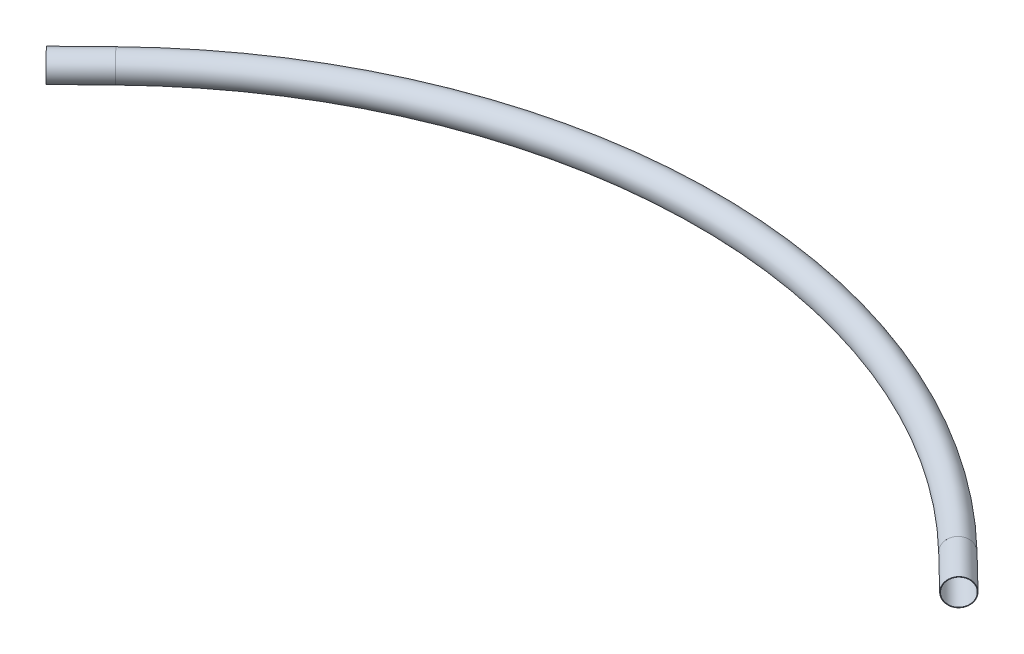
ISO-10303-21;
HEADER;
FILE_DESCRIPTION(('STEP AP214'),'2;1');
FILE_NAME('part.step','',(''),(''),'','','');
FILE_SCHEMA(('AUTOMOTIVE_DESIGN { 1 0 10303 214 1 1 1 1 }'));
ENDSEC;
DATA;
#1=APPLICATION_CONTEXT('core data for automotive mechanical design processes');
#2=APPLICATION_PROTOCOL_DEFINITION('international standard','automotive_design',2000,#1);
#3=PRODUCT_CONTEXT('',#1,'mechanical');
#4=PRODUCT('Part','Part','',(#3));
#5=PRODUCT_RELATED_PRODUCT_CATEGORY('part','',(#4));
#6=PRODUCT_DEFINITION_FORMATION('','',#4);
#7=PRODUCT_DEFINITION_CONTEXT('part definition',#1,'design');
#8=PRODUCT_DEFINITION('design','',#6,#7);
#9=PRODUCT_DEFINITION_SHAPE('','',#8);
#10=(LENGTH_UNIT() NAMED_UNIT(*) SI_UNIT(.MILLI.,.METRE.));
#11=(NAMED_UNIT(*) PLANE_ANGLE_UNIT() SI_UNIT($,.RADIAN.));
#12=(NAMED_UNIT(*) SI_UNIT($,.STERADIAN.) SOLID_ANGLE_UNIT());
#13=UNCERTAINTY_MEASURE_WITH_UNIT(LENGTH_MEASURE(1.E-05),#10,'distance_accuracy_value','');
#14=(GEOMETRIC_REPRESENTATION_CONTEXT(3) GLOBAL_UNCERTAINTY_ASSIGNED_CONTEXT((#13)) GLOBAL_UNIT_ASSIGNED_CONTEXT((#10,
#11,#12)) REPRESENTATION_CONTEXT('',''));
#15=CARTESIAN_POINT('',(0.,0.,0.));
#16=DIRECTION('',(0.,0.,1.));
#17=DIRECTION('',(1.,0.,0.));
#18=AXIS2_PLACEMENT_3D('',#15,#16,#17);
#19=CARTESIAN_POINT('',(-2829.94414233695,0.,212.503852328924));
#20=DIRECTION('',(0.716885309504422,0.,-0.697191116564712));
#21=DIRECTION('',(-0.697191116564712,0.,-0.716885309504422));
#22=AXIS2_PLACEMENT_3D('',#19,#20,#21);
#23=CYLINDRICAL_SURFACE('',#22,80.7339000000001);
#24=CARTESIAN_POINT('',(-2829.94414233695,0.,212.503852328924));
#25=DIRECTION('',(-0.71688530950442,0.,0.697191116564713));
#26=DIRECTION('',(0.697191116564713,0.,0.71688530950442));
#27=AXIS2_PLACEMENT_3D('',#24,#25,#26);
#28=CIRCLE('',#27,80.7339000000001);
#29=CARTESIAN_POINT('',(-2773.65718445132,0.,270.380799217923));
#30=VERTEX_POINT('',#29);
#31=EDGE_CURVE('E52',#30,#30,#28,.T.);
#32=ORIENTED_EDGE('',*,*,#31,.T.);
#33=EDGE_LOOP('',(#32));
#34=FACE_BOUND('',#33,.T.);
#35=CARTESIAN_POINT('',(-2611.4375,0.,0.));
#36=DIRECTION('',(-0.71688530950442,0.,0.697191116564713));
#37=DIRECTION('',(0.697191116564713,0.,0.71688530950442));
#38=AXIS2_PLACEMENT_3D('',#35,#36,#37);
#39=CIRCLE('',#38,80.7339000000001);
#40=CARTESIAN_POINT('',(-2555.15054211438,0.,57.876946888999));
#41=VERTEX_POINT('',#40);
#42=EDGE_CURVE('E58',#41,#41,#39,.T.);
#43=ORIENTED_EDGE('',*,*,#42,.F.);
#44=EDGE_LOOP('',(#43));
#45=FACE_BOUND('',#44,.T.);
#46=ADVANCED_FACE('F45',(#34,#45),#23,.F.);
#47=CARTESIAN_POINT('',(-2829.94414233695,0.,212.503852328924));
#48=DIRECTION('',(0.716885309504422,0.,-0.697191116564712));
#49=DIRECTION('',(-0.697191116564712,0.,-0.716885309504422));
#50=AXIS2_PLACEMENT_3D('',#47,#48,#49);
#51=CYLINDRICAL_SURFACE('',#50,84.1375000000001);
#52=CARTESIAN_POINT('',(-2829.94414233695,0.,212.503852328924));
#53=DIRECTION('',(-0.71688530950442,0.,0.697191116564713));
#54=DIRECTION('',(0.697191116564713,0.,0.71688530950442));
#55=AXIS2_PLACEMENT_3D('',#52,#53,#54);
#56=CIRCLE('',#55,84.1375000000001);
#57=CARTESIAN_POINT('',(-2771.28422476698,0.,272.820790057352));
#58=VERTEX_POINT('',#57);
#59=EDGE_CURVE('E12',#58,#58,#56,.T.);
#60=ORIENTED_EDGE('',*,*,#59,.F.);
#61=EDGE_LOOP('',(#60));
#62=FACE_BOUND('',#61,.T.);
#63=CARTESIAN_POINT('',(-2611.4375,0.,0.));
#64=DIRECTION('',(-0.71688530950442,0.,0.697191116564713));
#65=DIRECTION('',(0.697191116564713,0.,0.71688530950442));
#66=AXIS2_PLACEMENT_3D('',#63,#64,#65);
#67=CIRCLE('',#66,84.1375000000001);
#68=CARTESIAN_POINT('',(-2552.77758243004,0.,60.3169377284283));
#69=VERTEX_POINT('',#68);
#70=EDGE_CURVE('E48',#69,#69,#67,.T.);
#71=ORIENTED_EDGE('',*,*,#70,.T.);
#72=EDGE_LOOP('',(#71));
#73=FACE_BOUND('',#72,.T.);
#74=ADVANCED_FACE('F65',(#62,#73),#51,.T.);
#75=CARTESIAN_POINT('',(-2829.94414233695,0.,212.503852328924));
#76=DIRECTION('',(-0.71688530950442,0.,0.697191116564713));
#77=DIRECTION('',(0.697191116564713,0.,0.71688530950442));
#78=AXIS2_PLACEMENT_3D('',#75,#76,#77);
#79=PLANE('',#78);
#80=ORIENTED_EDGE('',*,*,#31,.F.);
#81=EDGE_LOOP('',(#80));
#82=FACE_BOUND('',#81,.T.);
#83=ORIENTED_EDGE('',*,*,#59,.T.);
#84=EDGE_LOOP('',(#83));
#85=FACE_BOUND('',#84,.T.);
#86=ADVANCED_FACE('F69',(#82,#85),#79,.T.);
#87=CARTESIAN_POINT('',(-2611.4375,0.,0.));
#88=DIRECTION('',(-0.71688530950442,0.,0.697191116564713));
#89=DIRECTION('',(0.697191116564713,0.,0.71688530950442));
#90=AXIS2_PLACEMENT_3D('',#87,#88,#89);
#91=PLANE('',#90);
#92=ORIENTED_EDGE('',*,*,#42,.T.);
#93=EDGE_LOOP('',(#92));
#94=FACE_BOUND('',#93,.T.);
#95=ORIENTED_EDGE('',*,*,#70,.F.);
#96=EDGE_LOOP('',(#95));
#97=FACE_BOUND('',#96,.T.);
#98=ADVANCED_FACE('F67',(#94,#97),#91,.F.);
#99=CLOSED_SHELL('',(#46,#74,#86,#98));
#100=MANIFOLD_SOLID_BREP('B2',#99);
#101=CARTESIAN_POINT('',(0.,0.,2685.20515531437));
#102=DIRECTION('',(0.,-1.,0.));
#103=DIRECTION('',(0.,0.,-1.));
#104=AXIS2_PLACEMENT_3D('',#101,#102,#103);
#105=TOROIDAL_SURFACE('',#104,3745.65515531437,80.7339000000001);
#106=CARTESIAN_POINT('',(-2611.4375,0.,4.44089209850063E-13));
#107=DIRECTION('',(-0.71688530950442,0.,0.697191116564713));
#108=DIRECTION('',(0.697191116564713,0.,0.71688530950442));
#109=AXIS2_PLACEMENT_3D('',#106,#107,#108);
#110=CIRCLE('',#109,80.7339000000001);
#111=CARTESIAN_POINT('',(-2667.72445788562,0.,-57.8769468889986));
#112=VERTEX_POINT('',#111);
#113=EDGE_CURVE('E129',#112,#112,#110,.T.);
#114=CARTESIAN_POINT('',(2611.4375,0.,0.));
#115=DIRECTION('',(-0.716885309504421,0.,-0.697191116564713));
#116=DIRECTION('',(-0.697191116564713,0.,0.716885309504421));
#117=AXIS2_PLACEMENT_3D('',#114,#115,#116);
#118=CIRCLE('',#117,80.7339000000001);
#119=CARTESIAN_POINT('',(2667.72445788562,0.,-57.876946888999));
#120=VERTEX_POINT('',#119);
#121=EDGE_CURVE('E137',#120,#120,#118,.T.);
#122=CARTESIAN_POINT('',(0.,0.,2685.20515531437));
#123=DIRECTION('',(0.,-1.,0.));
#124=DIRECTION('',(0.,0.,-1.));
#125=AXIS2_PLACEMENT_3D('',#122,#123,#124);
#126=CIRCLE('',#125,3826.38905531437);
#127=EDGE_CURVE('',#112,#120,#126,.T.);
#128=ORIENTED_EDGE('',*,*,#113,.T.);
#129=ORIENTED_EDGE('',*,*,#121,.F.);
#130=ORIENTED_EDGE('',*,*,#127,.T.);
#131=ORIENTED_EDGE('',*,*,#127,.F.);
#132=EDGE_LOOP('',(#128,#130,#129,#131));
#133=FACE_BOUND('',#132,.T.);
#134=ADVANCED_FACE('F122',(#133),#105,.F.);
#135=CARTESIAN_POINT('',(0.,0.,2685.20515531437));
#136=DIRECTION('',(0.,-1.,0.));
#137=DIRECTION('',(0.,0.,-1.));
#138=AXIS2_PLACEMENT_3D('',#135,#136,#137);
#139=TOROIDAL_SURFACE('',#138,3745.65515531437,84.1375000000001);
#140=CARTESIAN_POINT('',(-2611.4375,0.,4.44089209850063E-13));
#141=DIRECTION('',(-0.71688530950442,0.,0.697191116564713));
#142=DIRECTION('',(0.697191116564713,0.,0.71688530950442));
#143=AXIS2_PLACEMENT_3D('',#140,#141,#142);
#144=CIRCLE('',#143,84.1375000000001);
#145=CARTESIAN_POINT('',(-2670.09741756996,0.,-60.3169377284276));
#146=VERTEX_POINT('',#145);
#147=EDGE_CURVE('E44',#146,#146,#144,.T.);
#148=CARTESIAN_POINT('',(2611.4375,0.,0.));
#149=DIRECTION('',(-0.716885309504421,0.,-0.697191116564713));
#150=DIRECTION('',(-0.697191116564713,0.,0.716885309504421));
#151=AXIS2_PLACEMENT_3D('',#148,#149,#150);
#152=CIRCLE('',#151,84.1375000000001);
#153=CARTESIAN_POINT('',(2670.09741756996,0.,-60.3169377284281));
#154=VERTEX_POINT('',#153);
#155=EDGE_CURVE('E133',#154,#154,#152,.T.);
#156=CARTESIAN_POINT('',(0.,0.,2685.20515531437));
#157=DIRECTION('',(0.,-1.,0.));
#158=DIRECTION('',(0.,0.,-1.));
#159=AXIS2_PLACEMENT_3D('',#156,#157,#158);
#160=CIRCLE('',#159,3829.79265531437);
#161=EDGE_CURVE('',#146,#154,#160,.T.);
#162=ORIENTED_EDGE('',*,*,#147,.F.);
#163=ORIENTED_EDGE('',*,*,#155,.T.);
#164=ORIENTED_EDGE('',*,*,#161,.T.);
#165=ORIENTED_EDGE('',*,*,#161,.F.);
#166=EDGE_LOOP('',(#162,#164,#163,#165));
#167=FACE_BOUND('',#166,.T.);
#168=ADVANCED_FACE('F124',(#167),#139,.T.);
#169=CARTESIAN_POINT('',(-2611.4375,0.,4.44089209850063E-13));
#170=DIRECTION('',(-0.71688530950442,0.,0.697191116564713));
#171=DIRECTION('',(0.697191116564713,0.,0.71688530950442));
#172=AXIS2_PLACEMENT_3D('',#169,#170,#171);
#173=PLANE('',#172);
#174=ORIENTED_EDGE('',*,*,#113,.F.);
#175=EDGE_LOOP('',(#174));
#176=FACE_BOUND('',#175,.T.);
#177=ORIENTED_EDGE('',*,*,#147,.T.);
#178=EDGE_LOOP('',(#177));
#179=FACE_BOUND('',#178,.T.);
#180=ADVANCED_FACE('F147',(#176,#179),#173,.T.);
#181=CARTESIAN_POINT('',(2611.4375,0.,0.));
#182=DIRECTION('',(-0.716885309504421,0.,-0.697191116564713));
#183=DIRECTION('',(-0.697191116564713,0.,0.716885309504421));
#184=AXIS2_PLACEMENT_3D('',#181,#182,#183);
#185=PLANE('',#184);
#186=ORIENTED_EDGE('',*,*,#121,.T.);
#187=EDGE_LOOP('',(#186));
#188=FACE_BOUND('',#187,.T.);
#189=ORIENTED_EDGE('',*,*,#155,.F.);
#190=EDGE_LOOP('',(#189));
#191=FACE_BOUND('',#190,.T.);
#192=ADVANCED_FACE('F143',(#188,#191),#185,.F.);
#193=CLOSED_SHELL('',(#134,#168,#180,#192));
#194=MANIFOLD_SOLID_BREP('B7',#193);
#195=CARTESIAN_POINT('',(2611.4375,0.,0.));
#196=DIRECTION('',(0.716885309504422,0.,0.697191116564712));
#197=DIRECTION('',(0.697191116564712,0.,-0.716885309504422));
#198=AXIS2_PLACEMENT_3D('',#195,#196,#197);
#199=CYLINDRICAL_SURFACE('',#198,80.7339000000001);
#200=CARTESIAN_POINT('',(2611.4375,0.,0.));
#201=DIRECTION('',(-0.716885309504421,0.,-0.697191116564713));
#202=DIRECTION('',(-0.697191116564713,0.,0.716885309504421));
#203=AXIS2_PLACEMENT_3D('',#200,#201,#202);
#204=CIRCLE('',#203,80.7339000000001);
#205=CARTESIAN_POINT('',(2555.15054211438,0.,57.8769468889991));
#206=VERTEX_POINT('',#205);
#207=EDGE_CURVE('E199',#206,#206,#204,.T.);
#208=ORIENTED_EDGE('',*,*,#207,.T.);
#209=EDGE_LOOP('',(#208));
#210=FACE_BOUND('',#209,.T.);
#211=CARTESIAN_POINT('',(2829.94414233695,0.,212.503852328924));
#212=DIRECTION('',(-0.716885309504421,0.,-0.697191116564713));
#213=DIRECTION('',(-0.697191116564713,0.,0.716885309504421));
#214=AXIS2_PLACEMENT_3D('',#211,#212,#213);
#215=CIRCLE('',#214,80.7339000000001);
#216=CARTESIAN_POINT('',(2773.65718445132,0.,270.380799217923));
#217=VERTEX_POINT('',#216);
#218=EDGE_CURVE('E205',#217,#217,#215,.T.);
#219=ORIENTED_EDGE('',*,*,#218,.F.);
#220=EDGE_LOOP('',(#219));
#221=FACE_BOUND('',#220,.T.);
#222=ADVANCED_FACE('F192',(#210,#221),#199,.F.);
#223=CARTESIAN_POINT('',(2611.4375,0.,0.));
#224=DIRECTION('',(0.716885309504422,0.,0.697191116564712));
#225=DIRECTION('',(0.697191116564712,0.,-0.716885309504422));
#226=AXIS2_PLACEMENT_3D('',#223,#224,#225);
#227=CYLINDRICAL_SURFACE('',#226,84.1375000000001);
#228=CARTESIAN_POINT('',(2611.4375,0.,0.));
#229=DIRECTION('',(-0.716885309504421,0.,-0.697191116564713));
#230=DIRECTION('',(-0.697191116564713,0.,0.716885309504421));
#231=AXIS2_PLACEMENT_3D('',#228,#229,#230);
#232=CIRCLE('',#231,84.1375000000001);
#233=CARTESIAN_POINT('',(2552.77758243004,0.,60.3169377284283));
#234=VERTEX_POINT('',#233);
#235=EDGE_CURVE('E121',#234,#234,#232,.T.);
#236=ORIENTED_EDGE('',*,*,#235,.F.);
#237=EDGE_LOOP('',(#236));
#238=FACE_BOUND('',#237,.T.);
#239=CARTESIAN_POINT('',(2829.94414233695,0.,212.503852328924));
#240=DIRECTION('',(-0.716885309504421,0.,-0.697191116564713));
#241=DIRECTION('',(-0.697191116564713,0.,0.716885309504421));
#242=AXIS2_PLACEMENT_3D('',#239,#240,#241);
#243=CIRCLE('',#242,84.1375000000001);
#244=CARTESIAN_POINT('',(2771.28422476698,0.,272.820790057352));
#245=VERTEX_POINT('',#244);
#246=EDGE_CURVE('E195',#245,#245,#243,.T.);
#247=ORIENTED_EDGE('',*,*,#246,.T.);
#248=EDGE_LOOP('',(#247));
#249=FACE_BOUND('',#248,.T.);
#250=ADVANCED_FACE('F212',(#238,#249),#227,.T.);
#251=CARTESIAN_POINT('',(2611.4375,0.,0.));
#252=DIRECTION('',(-0.716885309504421,0.,-0.697191116564713));
#253=DIRECTION('',(-0.697191116564713,0.,0.716885309504421));
#254=AXIS2_PLACEMENT_3D('',#251,#252,#253);
#255=PLANE('',#254);
#256=ORIENTED_EDGE('',*,*,#207,.F.);
#257=EDGE_LOOP('',(#256));
#258=FACE_BOUND('',#257,.T.);
#259=ORIENTED_EDGE('',*,*,#235,.T.);
#260=EDGE_LOOP('',(#259));
#261=FACE_BOUND('',#260,.T.);
#262=ADVANCED_FACE('F216',(#258,#261),#255,.T.);
#263=CARTESIAN_POINT('',(2829.94414233695,0.,212.503852328924));
#264=DIRECTION('',(-0.716885309504421,0.,-0.697191116564713));
#265=DIRECTION('',(-0.697191116564713,0.,0.716885309504421));
#266=AXIS2_PLACEMENT_3D('',#263,#264,#265);
#267=PLANE('',#266);
#268=ORIENTED_EDGE('',*,*,#218,.T.);
#269=EDGE_LOOP('',(#268));
#270=FACE_BOUND('',#269,.T.);
#271=ORIENTED_EDGE('',*,*,#246,.F.);
#272=EDGE_LOOP('',(#271));
#273=FACE_BOUND('',#272,.T.);
#274=ADVANCED_FACE('F214',(#270,#273),#267,.F.);
#275=CLOSED_SHELL('',(#222,#250,#262,#274));
#276=MANIFOLD_SOLID_BREP('B39',#275);
#277=ADVANCED_BREP_SHAPE_REPRESENTATION('',(#18,#100,#194,#276),#14);
#278=SHAPE_DEFINITION_REPRESENTATION(#9,#277);
ENDSEC;
END-ISO-10303-21;
